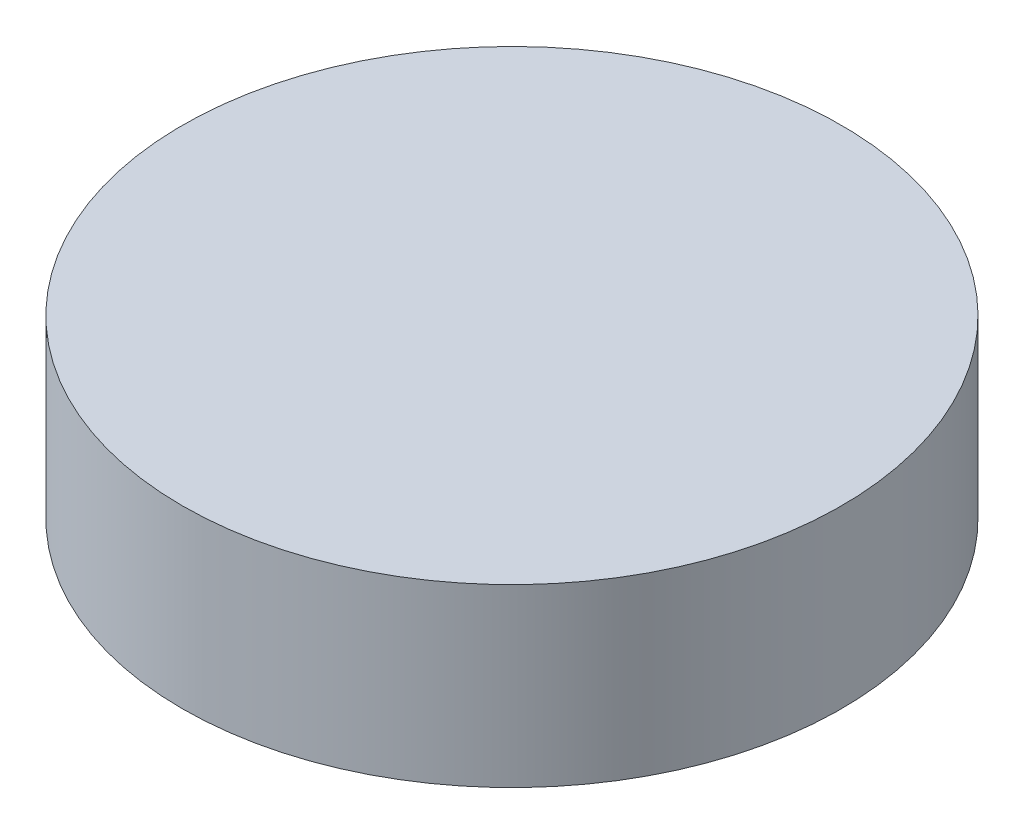
ISO-10303-21;
HEADER;
FILE_DESCRIPTION(('STEP AP214'),'2;1');
FILE_NAME('part.step','',(''),(''),'','','');
FILE_SCHEMA(('AUTOMOTIVE_DESIGN { 1 0 10303 214 1 1 1 1 }'));
ENDSEC;
DATA;
#1=APPLICATION_CONTEXT('core data for automotive mechanical design processes');
#2=APPLICATION_PROTOCOL_DEFINITION('international standard','automotive_design',2000,#1);
#3=PRODUCT_CONTEXT('',#1,'mechanical');
#4=PRODUCT('Part','Part','',(#3));
#5=PRODUCT_RELATED_PRODUCT_CATEGORY('part','',(#4));
#6=PRODUCT_DEFINITION_FORMATION('','',#4);
#7=PRODUCT_DEFINITION_CONTEXT('part definition',#1,'design');
#8=PRODUCT_DEFINITION('design','',#6,#7);
#9=PRODUCT_DEFINITION_SHAPE('','',#8);
#10=(LENGTH_UNIT() NAMED_UNIT(*) SI_UNIT(.MILLI.,.METRE.));
#11=(NAMED_UNIT(*) PLANE_ANGLE_UNIT() SI_UNIT($,.RADIAN.));
#12=(NAMED_UNIT(*) SI_UNIT($,.STERADIAN.) SOLID_ANGLE_UNIT());
#13=UNCERTAINTY_MEASURE_WITH_UNIT(LENGTH_MEASURE(1.E-05),#10,'distance_accuracy_value','');
#14=(GEOMETRIC_REPRESENTATION_CONTEXT(3) GLOBAL_UNCERTAINTY_ASSIGNED_CONTEXT((#13)) GLOBAL_UNIT_ASSIGNED_CONTEXT((#10,
#11,#12)) REPRESENTATION_CONTEXT('',''));
#15=CARTESIAN_POINT('',(0.,0.,0.));
#16=DIRECTION('',(0.,0.,1.));
#17=DIRECTION('',(1.,0.,0.));
#18=AXIS2_PLACEMENT_3D('',#15,#16,#17);
#19=CARTESIAN_POINT('',(0.,1.6,0.));
#20=DIRECTION('',(0.,-1.,0.));
#21=DIRECTION('',(0.,0.,-1.));
#22=AXIS2_PLACEMENT_3D('',#19,#20,#21);
#23=CYLINDRICAL_SURFACE('',#22,3.);
#24=CARTESIAN_POINT('',(0.,1.6,0.));
#25=DIRECTION('',(0.,1.,0.));
#26=DIRECTION('',(0.,0.,1.));
#27=AXIS2_PLACEMENT_3D('',#24,#25,#26);
#28=CIRCLE('',#27,3.);
#29=CARTESIAN_POINT('',(0.,1.6,3.));
#30=VERTEX_POINT('',#29);
#31=EDGE_CURVE('E10',#30,#30,#28,.T.);
#32=ORIENTED_EDGE('',*,*,#31,.F.);
#33=EDGE_LOOP('',(#32));
#34=FACE_BOUND('',#33,.T.);
#35=CARTESIAN_POINT('',(0.,0.,0.));
#36=DIRECTION('',(0.,1.,0.));
#37=DIRECTION('',(0.,0.,1.));
#38=AXIS2_PLACEMENT_3D('',#35,#36,#37);
#39=CIRCLE('',#38,3.);
#40=CARTESIAN_POINT('',(0.,0.,3.));
#41=VERTEX_POINT('',#40);
#42=EDGE_CURVE('E29',#41,#41,#39,.T.);
#43=ORIENTED_EDGE('',*,*,#42,.T.);
#44=EDGE_LOOP('',(#43));
#45=FACE_BOUND('',#44,.T.);
#46=ADVANCED_FACE('F26',(#34,#45),#23,.T.);
#47=CARTESIAN_POINT('',(0.,1.6,0.));
#48=DIRECTION('',(0.,1.,0.));
#49=DIRECTION('',(0.,0.,1.));
#50=AXIS2_PLACEMENT_3D('',#47,#48,#49);
#51=PLANE('',#50);
#52=ORIENTED_EDGE('',*,*,#31,.T.);
#53=EDGE_LOOP('',(#52));
#54=FACE_BOUND('',#53,.T.);
#55=ADVANCED_FACE('F41',(#54),#51,.T.);
#56=CARTESIAN_POINT('',(0.,0.,0.));
#57=DIRECTION('',(0.,1.,0.));
#58=DIRECTION('',(0.,0.,1.));
#59=AXIS2_PLACEMENT_3D('',#56,#57,#58);
#60=PLANE('',#59);
#61=ORIENTED_EDGE('',*,*,#42,.F.);
#62=EDGE_LOOP('',(#61));
#63=FACE_BOUND('',#62,.T.);
#64=ADVANCED_FACE('F39',(#63),#60,.F.);
#65=CLOSED_SHELL('',(#46,#55,#64));
#66=MANIFOLD_SOLID_BREP('B2',#65);
#67=ADVANCED_BREP_SHAPE_REPRESENTATION('',(#18,#66),#14);
#68=SHAPE_DEFINITION_REPRESENTATION(#9,#67);
ENDSEC;
END-ISO-10303-21;
